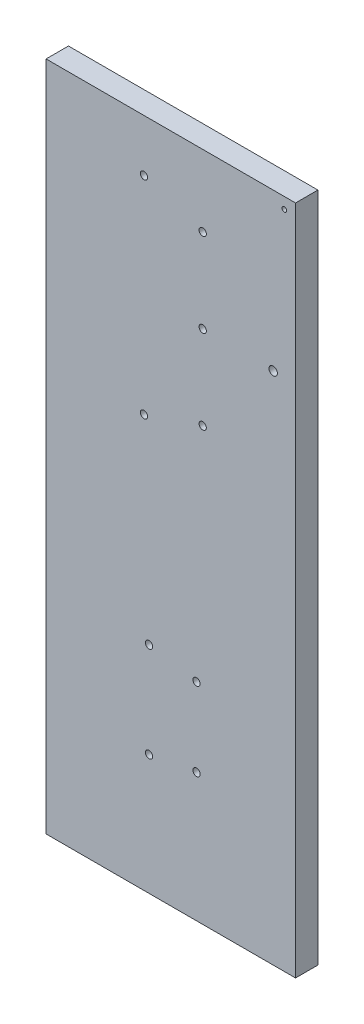
ISO-10303-21;
HEADER;
FILE_DESCRIPTION(('STEP AP214'),'2;1');
FILE_NAME('part.step','',(''),(''),'','','');
FILE_SCHEMA(('AUTOMOTIVE_DESIGN { 1 0 10303 214 1 1 1 1 }'));
ENDSEC;
DATA;
#1=APPLICATION_CONTEXT('core data for automotive mechanical design processes');
#2=APPLICATION_PROTOCOL_DEFINITION('international standard','automotive_design',2000,#1);
#3=PRODUCT_CONTEXT('',#1,'mechanical');
#4=PRODUCT('Part','Part','',(#3));
#5=PRODUCT_RELATED_PRODUCT_CATEGORY('part','',(#4));
#6=PRODUCT_DEFINITION_FORMATION('','',#4);
#7=PRODUCT_DEFINITION_CONTEXT('part definition',#1,'design');
#8=PRODUCT_DEFINITION('design','',#6,#7);
#9=PRODUCT_DEFINITION_SHAPE('','',#8);
#10=(LENGTH_UNIT() NAMED_UNIT(*) SI_UNIT(.MILLI.,.METRE.));
#11=(NAMED_UNIT(*) PLANE_ANGLE_UNIT() SI_UNIT($,.RADIAN.));
#12=(NAMED_UNIT(*) SI_UNIT($,.STERADIAN.) SOLID_ANGLE_UNIT());
#13=UNCERTAINTY_MEASURE_WITH_UNIT(LENGTH_MEASURE(1.E-05),#10,'distance_accuracy_value','');
#14=(GEOMETRIC_REPRESENTATION_CONTEXT(3) GLOBAL_UNCERTAINTY_ASSIGNED_CONTEXT((#13)) GLOBAL_UNIT_ASSIGNED_CONTEXT((#10,
#11,#12)) REPRESENTATION_CONTEXT('',''));
#15=CARTESIAN_POINT('',(0.,0.,0.));
#16=DIRECTION('',(0.,0.,1.));
#17=DIRECTION('',(1.,0.,0.));
#18=AXIS2_PLACEMENT_3D('',#15,#16,#17);
#19=CARTESIAN_POINT('',(0.,0.,20.));
#20=DIRECTION('',(1.,0.,0.));
#21=DIRECTION('',(0.,0.,-1.));
#22=AXIS2_PLACEMENT_3D('',#19,#20,#21);
#23=PLANE('',#22);
#24=DIRECTION('',(0.,-1.,0.));
#25=VECTOR('',#24,1.);
#26=CARTESIAN_POINT('',(0.,0.,0.));
#27=LINE('',#26,#25);
#28=CARTESIAN_POINT('',(0.,600.,0.));
#29=VERTEX_POINT('',#28);
#30=CARTESIAN_POINT('',(0.,0.,0.));
#31=VERTEX_POINT('',#30);
#32=EDGE_CURVE('E216',#29,#31,#27,.T.);
#33=ORIENTED_EDGE('',*,*,#32,.T.);
#34=DIRECTION('',(0.,0.,-1.));
#35=VECTOR('',#34,1.);
#36=CARTESIAN_POINT('',(0.,0.,20.));
#37=LINE('',#36,#35);
#38=CARTESIAN_POINT('',(0.,0.,20.));
#39=VERTEX_POINT('',#38);
#40=EDGE_CURVE('E11',#39,#31,#37,.T.);
#41=ORIENTED_EDGE('',*,*,#40,.F.);
#42=DIRECTION('',(0.,-1.,0.));
#43=VECTOR('',#42,1.);
#44=CARTESIAN_POINT('',(0.,0.,20.));
#45=LINE('',#44,#43);
#46=CARTESIAN_POINT('',(0.,600.,20.));
#47=VERTEX_POINT('',#46);
#48=EDGE_CURVE('E217',#47,#39,#45,.T.);
#49=ORIENTED_EDGE('',*,*,#48,.F.);
#50=DIRECTION('',(0.,0.,-1.));
#51=VECTOR('',#50,1.);
#52=CARTESIAN_POINT('',(0.,600.,20.));
#53=LINE('',#52,#51);
#54=EDGE_CURVE('E223',#47,#29,#53,.T.);
#55=ORIENTED_EDGE('',*,*,#54,.T.);
#56=EDGE_LOOP('',(#33,#41,#49,#55));
#57=FACE_BOUND('',#56,.T.);
#58=ADVANCED_FACE('F36',(#57),#23,.F.);
#59=CARTESIAN_POINT('',(0.,0.,20.));
#60=DIRECTION('',(0.,1.,0.));
#61=DIRECTION('',(0.,0.,1.));
#62=AXIS2_PLACEMENT_3D('',#59,#60,#61);
#63=PLANE('',#62);
#64=DIRECTION('',(1.,0.,0.));
#65=VECTOR('',#64,1.);
#66=CARTESIAN_POINT('',(0.,0.,0.));
#67=LINE('',#66,#65);
#68=CARTESIAN_POINT('',(223.,0.,0.));
#69=VERTEX_POINT('',#68);
#70=EDGE_CURVE('E226',#31,#69,#67,.T.);
#71=ORIENTED_EDGE('',*,*,#70,.T.);
#72=DIRECTION('',(0.,0.,-1.));
#73=VECTOR('',#72,1.);
#74=CARTESIAN_POINT('',(223.,0.,20.));
#75=LINE('',#74,#73);
#76=CARTESIAN_POINT('',(223.,0.,20.));
#77=VERTEX_POINT('',#76);
#78=EDGE_CURVE('E44',#77,#69,#75,.T.);
#79=ORIENTED_EDGE('',*,*,#78,.F.);
#80=DIRECTION('',(1.,0.,0.));
#81=VECTOR('',#80,1.);
#82=CARTESIAN_POINT('',(0.,0.,20.));
#83=LINE('',#82,#81);
#84=EDGE_CURVE('E83',#39,#77,#83,.T.);
#85=ORIENTED_EDGE('',*,*,#84,.F.);
#86=ORIENTED_EDGE('',*,*,#40,.T.);
#87=EDGE_LOOP('',(#71,#79,#85,#86));
#88=FACE_BOUND('',#87,.T.);
#89=ADVANCED_FACE('F250',(#88),#63,.F.);
#90=CARTESIAN_POINT('',(223.,0.,20.));
#91=DIRECTION('',(-1.,0.,0.));
#92=DIRECTION('',(0.,0.,1.));
#93=AXIS2_PLACEMENT_3D('',#90,#91,#92);
#94=PLANE('',#93);
#95=DIRECTION('',(0.,1.,0.));
#96=VECTOR('',#95,1.);
#97=CARTESIAN_POINT('',(223.,0.,0.));
#98=LINE('',#97,#96);
#99=CARTESIAN_POINT('',(223.,600.,0.));
#100=VERTEX_POINT('',#99);
#101=EDGE_CURVE('E70',#69,#100,#98,.T.);
#102=ORIENTED_EDGE('',*,*,#101,.T.);
#103=DIRECTION('',(0.,0.,-1.));
#104=VECTOR('',#103,1.);
#105=CARTESIAN_POINT('',(223.,600.,20.));
#106=LINE('',#105,#104);
#107=CARTESIAN_POINT('',(223.,600.,20.));
#108=VERTEX_POINT('',#107);
#109=EDGE_CURVE('E231',#108,#100,#106,.T.);
#110=ORIENTED_EDGE('',*,*,#109,.F.);
#111=DIRECTION('',(0.,1.,0.));
#112=VECTOR('',#111,1.);
#113=CARTESIAN_POINT('',(223.,0.,20.));
#114=LINE('',#113,#112);
#115=EDGE_CURVE('E220',#77,#108,#114,.T.);
#116=ORIENTED_EDGE('',*,*,#115,.F.);
#117=ORIENTED_EDGE('',*,*,#78,.T.);
#118=EDGE_LOOP('',(#102,#110,#116,#117));
#119=FACE_BOUND('',#118,.T.);
#120=ADVANCED_FACE('F233',(#119),#94,.F.);
#121=CARTESIAN_POINT('',(0.,600.,20.));
#122=DIRECTION('',(0.,-1.,0.));
#123=DIRECTION('',(0.,0.,-1.));
#124=AXIS2_PLACEMENT_3D('',#121,#122,#123);
#125=PLANE('',#124);
#126=DIRECTION('',(-1.,0.,0.));
#127=VECTOR('',#126,1.);
#128=CARTESIAN_POINT('',(0.,600.,0.));
#129=LINE('',#128,#127);
#130=EDGE_CURVE('E76',#100,#29,#129,.T.);
#131=ORIENTED_EDGE('',*,*,#130,.T.);
#132=ORIENTED_EDGE('',*,*,#54,.F.);
#133=DIRECTION('',(-1.,0.,0.));
#134=VECTOR('',#133,1.);
#135=CARTESIAN_POINT('',(0.,600.,20.));
#136=LINE('',#135,#134);
#137=EDGE_CURVE('E52',#108,#47,#136,.T.);
#138=ORIENTED_EDGE('',*,*,#137,.F.);
#139=ORIENTED_EDGE('',*,*,#109,.T.);
#140=EDGE_LOOP('',(#131,#132,#138,#139));
#141=FACE_BOUND('',#140,.T.);
#142=ADVANCED_FACE('F240',(#141),#125,.F.);
#143=CARTESIAN_POINT('',(0.,600.,20.));
#144=DIRECTION('',(0.,0.,-1.));
#145=DIRECTION('',(-1.,0.,0.));
#146=AXIS2_PLACEMENT_3D('',#143,#144,#145);
#147=PLANE('',#146);
#148=CARTESIAN_POINT('',(213.,590.,20.));
#149=DIRECTION('',(0.,0.,1.));
#150=DIRECTION('',(1.,0.,0.));
#151=AXIS2_PLACEMENT_3D('',#148,#149,#150);
#152=CIRCLE('',#151,2.09999999999999);
#153=CARTESIAN_POINT('',(215.1,590.,20.));
#154=VERTEX_POINT('',#153);
#155=EDGE_CURVE('E98',#154,#154,#152,.T.);
#156=ORIENTED_EDGE('',*,*,#155,.F.);
#157=EDGE_LOOP('',(#156));
#158=FACE_BOUND('',#157,.T.);
#159=CARTESIAN_POINT('',(203.,460.,20.));
#160=DIRECTION('',(0.,0.,1.));
#161=DIRECTION('',(1.,0.,0.));
#162=AXIS2_PLACEMENT_3D('',#159,#160,#161);
#163=CIRCLE('',#162,3.75000000000001);
#164=CARTESIAN_POINT('',(206.75,460.,20.));
#165=VERTEX_POINT('',#164);
#166=EDGE_CURVE('E97',#165,#165,#163,.T.);
#167=ORIENTED_EDGE('',*,*,#166,.F.);
#168=EDGE_LOOP('',(#167));
#169=FACE_BOUND('',#168,.T.);
#170=CARTESIAN_POINT('',(87.5,368.5,20.));
#171=DIRECTION('',(0.,0.,-1.));
#172=DIRECTION('',(-1.,0.,0.));
#173=AXIS2_PLACEMENT_3D('',#170,#171,#172);
#174=CIRCLE('',#173,3.24999999999999);
#175=CARTESIAN_POINT('',(84.25,368.5,20.));
#176=VERTEX_POINT('',#175);
#177=EDGE_CURVE('E117',#176,#176,#174,.T.);
#178=ORIENTED_EDGE('',*,*,#177,.T.);
#179=EDGE_LOOP('',(#178));
#180=FACE_BOUND('',#179,.T.);
#181=CARTESIAN_POINT('',(87.5,553.5,20.));
#182=DIRECTION('',(0.,0.,-1.));
#183=DIRECTION('',(-1.,0.,0.));
#184=AXIS2_PLACEMENT_3D('',#181,#182,#183);
#185=CIRCLE('',#184,3.24999999999999);
#186=CARTESIAN_POINT('',(84.25,553.5,20.));
#187=VERTEX_POINT('',#186);
#188=EDGE_CURVE('E129',#187,#187,#185,.T.);
#189=ORIENTED_EDGE('',*,*,#188,.T.);
#190=EDGE_LOOP('',(#189));
#191=FACE_BOUND('',#190,.T.);
#192=CARTESIAN_POINT('',(140.,386.,20.));
#193=DIRECTION('',(0.,0.,-1.));
#194=DIRECTION('',(-1.,0.,0.));
#195=AXIS2_PLACEMENT_3D('',#192,#193,#194);
#196=CIRCLE('',#195,3.25);
#197=CARTESIAN_POINT('',(136.75,386.,20.));
#198=VERTEX_POINT('',#197);
#199=EDGE_CURVE('E141',#198,#198,#196,.T.);
#200=ORIENTED_EDGE('',*,*,#199,.T.);
#201=EDGE_LOOP('',(#200));
#202=FACE_BOUND('',#201,.T.);
#203=CARTESIAN_POINT('',(140.,461.,20.));
#204=DIRECTION('',(0.,0.,-1.));
#205=DIRECTION('',(-1.,0.,0.));
#206=AXIS2_PLACEMENT_3D('',#203,#204,#205);
#207=CIRCLE('',#206,3.25);
#208=CARTESIAN_POINT('',(136.75,461.,20.));
#209=VERTEX_POINT('',#208);
#210=EDGE_CURVE('E153',#209,#209,#207,.T.);
#211=ORIENTED_EDGE('',*,*,#210,.T.);
#212=EDGE_LOOP('',(#211));
#213=FACE_BOUND('',#212,.T.);
#214=CARTESIAN_POINT('',(140.,536.,20.));
#215=DIRECTION('',(0.,0.,-1.));
#216=DIRECTION('',(-1.,0.,0.));
#217=AXIS2_PLACEMENT_3D('',#214,#215,#216);
#218=CIRCLE('',#217,3.25);
#219=CARTESIAN_POINT('',(136.75,536.,20.));
#220=VERTEX_POINT('',#219);
#221=EDGE_CURVE('E165',#220,#220,#218,.T.);
#222=ORIENTED_EDGE('',*,*,#221,.T.);
#223=EDGE_LOOP('',(#222));
#224=FACE_BOUND('',#223,.T.);
#225=CARTESIAN_POINT('',(134.5,115.,20.));
#226=DIRECTION('',(0.,0.,-1.));
#227=DIRECTION('',(-1.,0.,0.));
#228=AXIS2_PLACEMENT_3D('',#225,#226,#227);
#229=CIRCLE('',#228,3.25);
#230=CARTESIAN_POINT('',(131.25,115.,20.));
#231=VERTEX_POINT('',#230);
#232=EDGE_CURVE('E177',#231,#231,#229,.T.);
#233=ORIENTED_EDGE('',*,*,#232,.T.);
#234=EDGE_LOOP('',(#233));
#235=FACE_BOUND('',#234,.T.);
#236=CARTESIAN_POINT('',(134.5,185.,20.));
#237=DIRECTION('',(0.,0.,-1.));
#238=DIRECTION('',(-1.,0.,0.));
#239=AXIS2_PLACEMENT_3D('',#236,#237,#238);
#240=CIRCLE('',#239,3.25);
#241=CARTESIAN_POINT('',(131.25,185.,20.));
#242=VERTEX_POINT('',#241);
#243=EDGE_CURVE('E189',#242,#242,#240,.T.);
#244=ORIENTED_EDGE('',*,*,#243,.T.);
#245=EDGE_LOOP('',(#244));
#246=FACE_BOUND('',#245,.T.);
#247=CARTESIAN_POINT('',(92.,107.5,20.));
#248=DIRECTION('',(0.,0.,-1.));
#249=DIRECTION('',(-1.,0.,0.));
#250=AXIS2_PLACEMENT_3D('',#247,#248,#249);
#251=CIRCLE('',#250,3.24999999999999);
#252=CARTESIAN_POINT('',(88.75,107.5,20.));
#253=VERTEX_POINT('',#252);
#254=EDGE_CURVE('E201',#253,#253,#251,.T.);
#255=ORIENTED_EDGE('',*,*,#254,.T.);
#256=EDGE_LOOP('',(#255));
#257=FACE_BOUND('',#256,.T.);
#258=CARTESIAN_POINT('',(92.,192.5,20.));
#259=DIRECTION('',(0.,0.,-1.));
#260=DIRECTION('',(-1.,0.,0.));
#261=AXIS2_PLACEMENT_3D('',#258,#259,#260);
#262=CIRCLE('',#261,3.24999999999999);
#263=CARTESIAN_POINT('',(88.75,192.5,20.));
#264=VERTEX_POINT('',#263);
#265=EDGE_CURVE('E213',#264,#264,#262,.T.);
#266=ORIENTED_EDGE('',*,*,#265,.T.);
#267=EDGE_LOOP('',(#266));
#268=FACE_BOUND('',#267,.T.);
#269=ORIENTED_EDGE('',*,*,#48,.T.);
#270=ORIENTED_EDGE('',*,*,#84,.T.);
#271=ORIENTED_EDGE('',*,*,#115,.T.);
#272=ORIENTED_EDGE('',*,*,#137,.T.);
#273=EDGE_LOOP('',(#269,#270,#271,#272));
#274=FACE_BOUND('',#273,.T.);
#275=ADVANCED_FACE('F242',(#158,#169,#180,#191,#202,#213,#224,#235,#246,#257,#268,#274),#147,.F.);
#276=CARTESIAN_POINT('',(0.,600.,0.));
#277=DIRECTION('',(0.,0.,-1.));
#278=DIRECTION('',(-1.,0.,0.));
#279=AXIS2_PLACEMENT_3D('',#276,#277,#278);
#280=PLANE('',#279);
#281=CARTESIAN_POINT('',(203.,460.,0.));
#282=DIRECTION('',(0.,0.,1.));
#283=DIRECTION('',(1.,0.,0.));
#284=AXIS2_PLACEMENT_3D('',#281,#282,#283);
#285=CIRCLE('',#284,3.75000000000001);
#286=CARTESIAN_POINT('',(206.75,460.,0.));
#287=VERTEX_POINT('',#286);
#288=EDGE_CURVE('E101',#287,#287,#285,.T.);
#289=ORIENTED_EDGE('',*,*,#288,.T.);
#290=EDGE_LOOP('',(#289));
#291=FACE_BOUND('',#290,.T.);
#292=CARTESIAN_POINT('',(87.5,368.5,0.));
#293=DIRECTION('',(0.,0.,-1.));
#294=DIRECTION('',(-1.,0.,0.));
#295=AXIS2_PLACEMENT_3D('',#292,#293,#294);
#296=CIRCLE('',#295,7.49999999999999);
#297=CARTESIAN_POINT('',(80.,368.5,0.));
#298=VERTEX_POINT('',#297);
#299=EDGE_CURVE('E107',#298,#298,#296,.T.);
#300=ORIENTED_EDGE('',*,*,#299,.F.);
#301=EDGE_LOOP('',(#300));
#302=FACE_BOUND('',#301,.T.);
#303=CARTESIAN_POINT('',(87.5,553.5,0.));
#304=DIRECTION('',(0.,0.,-1.));
#305=DIRECTION('',(-1.,0.,0.));
#306=AXIS2_PLACEMENT_3D('',#303,#304,#305);
#307=CIRCLE('',#306,7.49999999999999);
#308=CARTESIAN_POINT('',(80.,553.5,0.));
#309=VERTEX_POINT('',#308);
#310=EDGE_CURVE('E120',#309,#309,#307,.T.);
#311=ORIENTED_EDGE('',*,*,#310,.F.);
#312=EDGE_LOOP('',(#311));
#313=FACE_BOUND('',#312,.T.);
#314=CARTESIAN_POINT('',(140.,386.,0.));
#315=DIRECTION('',(0.,0.,-1.));
#316=DIRECTION('',(-1.,0.,0.));
#317=AXIS2_PLACEMENT_3D('',#314,#315,#316);
#318=CIRCLE('',#317,7.50000000000001);
#319=CARTESIAN_POINT('',(132.5,386.,0.));
#320=VERTEX_POINT('',#319);
#321=EDGE_CURVE('E132',#320,#320,#318,.T.);
#322=ORIENTED_EDGE('',*,*,#321,.F.);
#323=EDGE_LOOP('',(#322));
#324=FACE_BOUND('',#323,.T.);
#325=CARTESIAN_POINT('',(140.,461.,0.));
#326=DIRECTION('',(0.,0.,-1.));
#327=DIRECTION('',(-1.,0.,0.));
#328=AXIS2_PLACEMENT_3D('',#325,#326,#327);
#329=CIRCLE('',#328,7.50000000000001);
#330=CARTESIAN_POINT('',(132.5,461.,0.));
#331=VERTEX_POINT('',#330);
#332=EDGE_CURVE('E144',#331,#331,#329,.T.);
#333=ORIENTED_EDGE('',*,*,#332,.F.);
#334=EDGE_LOOP('',(#333));
#335=FACE_BOUND('',#334,.T.);
#336=CARTESIAN_POINT('',(140.,536.,0.));
#337=DIRECTION('',(0.,0.,-1.));
#338=DIRECTION('',(-1.,0.,0.));
#339=AXIS2_PLACEMENT_3D('',#336,#337,#338);
#340=CIRCLE('',#339,7.50000000000001);
#341=CARTESIAN_POINT('',(132.5,536.,0.));
#342=VERTEX_POINT('',#341);
#343=EDGE_CURVE('E156',#342,#342,#340,.T.);
#344=ORIENTED_EDGE('',*,*,#343,.F.);
#345=EDGE_LOOP('',(#344));
#346=FACE_BOUND('',#345,.T.);
#347=CARTESIAN_POINT('',(134.5,115.,0.));
#348=DIRECTION('',(0.,0.,-1.));
#349=DIRECTION('',(-1.,0.,0.));
#350=AXIS2_PLACEMENT_3D('',#347,#348,#349);
#351=CIRCLE('',#350,7.50000000000001);
#352=CARTESIAN_POINT('',(127.,115.,0.));
#353=VERTEX_POINT('',#352);
#354=EDGE_CURVE('E168',#353,#353,#351,.T.);
#355=ORIENTED_EDGE('',*,*,#354,.F.);
#356=EDGE_LOOP('',(#355));
#357=FACE_BOUND('',#356,.T.);
#358=CARTESIAN_POINT('',(134.5,185.,0.));
#359=DIRECTION('',(0.,0.,-1.));
#360=DIRECTION('',(-1.,0.,0.));
#361=AXIS2_PLACEMENT_3D('',#358,#359,#360);
#362=CIRCLE('',#361,7.50000000000001);
#363=CARTESIAN_POINT('',(127.,185.,0.));
#364=VERTEX_POINT('',#363);
#365=EDGE_CURVE('E180',#364,#364,#362,.T.);
#366=ORIENTED_EDGE('',*,*,#365,.F.);
#367=EDGE_LOOP('',(#366));
#368=FACE_BOUND('',#367,.T.);
#369=CARTESIAN_POINT('',(92.,107.5,0.));
#370=DIRECTION('',(0.,0.,-1.));
#371=DIRECTION('',(-1.,0.,0.));
#372=AXIS2_PLACEMENT_3D('',#369,#370,#371);
#373=CIRCLE('',#372,7.50000000000001);
#374=CARTESIAN_POINT('',(84.5,107.5,0.));
#375=VERTEX_POINT('',#374);
#376=EDGE_CURVE('E192',#375,#375,#373,.T.);
#377=ORIENTED_EDGE('',*,*,#376,.F.);
#378=EDGE_LOOP('',(#377));
#379=FACE_BOUND('',#378,.T.);
#380=CARTESIAN_POINT('',(92.,192.5,0.));
#381=DIRECTION('',(0.,0.,-1.));
#382=DIRECTION('',(-1.,0.,0.));
#383=AXIS2_PLACEMENT_3D('',#380,#381,#382);
#384=CIRCLE('',#383,7.50000000000001);
#385=CARTESIAN_POINT('',(84.5,192.5,0.));
#386=VERTEX_POINT('',#385);
#387=EDGE_CURVE('E204',#386,#386,#384,.T.);
#388=ORIENTED_EDGE('',*,*,#387,.F.);
#389=EDGE_LOOP('',(#388));
#390=FACE_BOUND('',#389,.T.);
#391=ORIENTED_EDGE('',*,*,#32,.F.);
#392=ORIENTED_EDGE('',*,*,#130,.F.);
#393=ORIENTED_EDGE('',*,*,#101,.F.);
#394=ORIENTED_EDGE('',*,*,#70,.F.);
#395=EDGE_LOOP('',(#391,#392,#393,#394));
#396=FACE_BOUND('',#395,.T.);
#397=ADVANCED_FACE('F236',(#291,#302,#313,#324,#335,#346,#357,#368,#379,#390,#396),#280,.T.);
#398=CARTESIAN_POINT('',(92.,192.5,0.));
#399=DIRECTION('',(0.,0.,-1.));
#400=DIRECTION('',(-1.,0.,0.));
#401=AXIS2_PLACEMENT_3D('',#398,#399,#400);
#402=CYLINDRICAL_SURFACE('',#401,3.25);
#403=ORIENTED_EDGE('',*,*,#265,.F.);
#404=EDGE_LOOP('',(#403));
#405=FACE_BOUND('',#404,.T.);
#406=CARTESIAN_POINT('',(92.,192.5,10.));
#407=DIRECTION('',(0.,0.,-1.));
#408=DIRECTION('',(-1.,0.,0.));
#409=AXIS2_PLACEMENT_3D('',#406,#407,#408);
#410=CIRCLE('',#409,3.25);
#411=CARTESIAN_POINT('',(88.75,192.5,10.));
#412=VERTEX_POINT('',#411);
#413=EDGE_CURVE('E210',#412,#412,#410,.T.);
#414=ORIENTED_EDGE('',*,*,#413,.T.);
#415=EDGE_LOOP('',(#414));
#416=FACE_BOUND('',#415,.T.);
#417=ADVANCED_FACE('F273',(#405,#416),#402,.F.);
#418=CARTESIAN_POINT('',(95.25,192.5,10.));
#419=DIRECTION('',(0.,0.,1.));
#420=DIRECTION('',(1.,0.,0.));
#421=AXIS2_PLACEMENT_3D('',#418,#419,#420);
#422=PLANE('',#421);
#423=ORIENTED_EDGE('',*,*,#413,.F.);
#424=EDGE_LOOP('',(#423));
#425=FACE_BOUND('',#424,.T.);
#426=CARTESIAN_POINT('',(92.,192.5,10.));
#427=DIRECTION('',(0.,0.,-1.));
#428=DIRECTION('',(-1.,0.,0.));
#429=AXIS2_PLACEMENT_3D('',#426,#427,#428);
#430=CIRCLE('',#429,7.49999999999999);
#431=CARTESIAN_POINT('',(84.5,192.5,10.));
#432=VERTEX_POINT('',#431);
#433=EDGE_CURVE('E207',#432,#432,#430,.T.);
#434=ORIENTED_EDGE('',*,*,#433,.T.);
#435=EDGE_LOOP('',(#434));
#436=FACE_BOUND('',#435,.T.);
#437=ADVANCED_FACE('F278',(#425,#436),#422,.F.);
#438=CARTESIAN_POINT('',(92.,192.5,0.));
#439=DIRECTION('',(0.,0.,-1.));
#440=DIRECTION('',(-1.,0.,0.));
#441=AXIS2_PLACEMENT_3D('',#438,#439,#440);
#442=CYLINDRICAL_SURFACE('',#441,7.5);
#443=ORIENTED_EDGE('',*,*,#433,.F.);
#444=EDGE_LOOP('',(#443));
#445=FACE_BOUND('',#444,.T.);
#446=ORIENTED_EDGE('',*,*,#387,.T.);
#447=EDGE_LOOP('',(#446));
#448=FACE_BOUND('',#447,.T.);
#449=ADVANCED_FACE('F290',(#445,#448),#442,.F.);
#450=CARTESIAN_POINT('',(92.,107.5,0.));
#451=DIRECTION('',(0.,0.,-1.));
#452=DIRECTION('',(-1.,0.,0.));
#453=AXIS2_PLACEMENT_3D('',#450,#451,#452);
#454=CYLINDRICAL_SURFACE('',#453,3.25);
#455=ORIENTED_EDGE('',*,*,#254,.F.);
#456=EDGE_LOOP('',(#455));
#457=FACE_BOUND('',#456,.T.);
#458=CARTESIAN_POINT('',(92.,107.5,10.));
#459=DIRECTION('',(0.,0.,-1.));
#460=DIRECTION('',(-1.,0.,0.));
#461=AXIS2_PLACEMENT_3D('',#458,#459,#460);
#462=CIRCLE('',#461,3.25);
#463=CARTESIAN_POINT('',(88.75,107.5,10.));
#464=VERTEX_POINT('',#463);
#465=EDGE_CURVE('E198',#464,#464,#462,.T.);
#466=ORIENTED_EDGE('',*,*,#465,.T.);
#467=EDGE_LOOP('',(#466));
#468=FACE_BOUND('',#467,.T.);
#469=ADVANCED_FACE('F300',(#457,#468),#454,.F.);
#470=CARTESIAN_POINT('',(95.25,107.5,10.));
#471=DIRECTION('',(0.,0.,1.));
#472=DIRECTION('',(1.,0.,0.));
#473=AXIS2_PLACEMENT_3D('',#470,#471,#472);
#474=PLANE('',#473);
#475=ORIENTED_EDGE('',*,*,#465,.F.);
#476=EDGE_LOOP('',(#475));
#477=FACE_BOUND('',#476,.T.);
#478=CARTESIAN_POINT('',(92.,107.5,10.));
#479=DIRECTION('',(0.,0.,-1.));
#480=DIRECTION('',(-1.,0.,0.));
#481=AXIS2_PLACEMENT_3D('',#478,#479,#480);
#482=CIRCLE('',#481,7.49999999999999);
#483=CARTESIAN_POINT('',(84.5,107.5,10.));
#484=VERTEX_POINT('',#483);
#485=EDGE_CURVE('E195',#484,#484,#482,.T.);
#486=ORIENTED_EDGE('',*,*,#485,.T.);
#487=EDGE_LOOP('',(#486));
#488=FACE_BOUND('',#487,.T.);
#489=ADVANCED_FACE('F310',(#477,#488),#474,.F.);
#490=CARTESIAN_POINT('',(92.,107.5,0.));
#491=DIRECTION('',(0.,0.,-1.));
#492=DIRECTION('',(-1.,0.,0.));
#493=AXIS2_PLACEMENT_3D('',#490,#491,#492);
#494=CYLINDRICAL_SURFACE('',#493,7.5);
#495=ORIENTED_EDGE('',*,*,#485,.F.);
#496=EDGE_LOOP('',(#495));
#497=FACE_BOUND('',#496,.T.);
#498=ORIENTED_EDGE('',*,*,#376,.T.);
#499=EDGE_LOOP('',(#498));
#500=FACE_BOUND('',#499,.T.);
#501=ADVANCED_FACE('F320',(#497,#500),#494,.F.);
#502=CARTESIAN_POINT('',(134.5,185.,0.));
#503=DIRECTION('',(0.,0.,-1.));
#504=DIRECTION('',(-1.,0.,0.));
#505=AXIS2_PLACEMENT_3D('',#502,#503,#504);
#506=CYLINDRICAL_SURFACE('',#505,3.25);
#507=ORIENTED_EDGE('',*,*,#243,.F.);
#508=EDGE_LOOP('',(#507));
#509=FACE_BOUND('',#508,.T.);
#510=CARTESIAN_POINT('',(134.5,185.,10.));
#511=DIRECTION('',(0.,0.,-1.));
#512=DIRECTION('',(-1.,0.,0.));
#513=AXIS2_PLACEMENT_3D('',#510,#511,#512);
#514=CIRCLE('',#513,3.25);
#515=CARTESIAN_POINT('',(131.25,185.,10.));
#516=VERTEX_POINT('',#515);
#517=EDGE_CURVE('E186',#516,#516,#514,.T.);
#518=ORIENTED_EDGE('',*,*,#517,.T.);
#519=EDGE_LOOP('',(#518));
#520=FACE_BOUND('',#519,.T.);
#521=ADVANCED_FACE('F330',(#509,#520),#506,.F.);
#522=CARTESIAN_POINT('',(137.75,185.,10.));
#523=DIRECTION('',(0.,0.,1.));
#524=DIRECTION('',(1.,0.,0.));
#525=AXIS2_PLACEMENT_3D('',#522,#523,#524);
#526=PLANE('',#525);
#527=ORIENTED_EDGE('',*,*,#517,.F.);
#528=EDGE_LOOP('',(#527));
#529=FACE_BOUND('',#528,.T.);
#530=CARTESIAN_POINT('',(134.5,185.,10.));
#531=DIRECTION('',(0.,0.,-1.));
#532=DIRECTION('',(-1.,0.,0.));
#533=AXIS2_PLACEMENT_3D('',#530,#531,#532);
#534=CIRCLE('',#533,7.50000000000001);
#535=CARTESIAN_POINT('',(127.,185.,10.));
#536=VERTEX_POINT('',#535);
#537=EDGE_CURVE('E183',#536,#536,#534,.T.);
#538=ORIENTED_EDGE('',*,*,#537,.T.);
#539=EDGE_LOOP('',(#538));
#540=FACE_BOUND('',#539,.T.);
#541=ADVANCED_FACE('F340',(#529,#540),#526,.F.);
#542=CARTESIAN_POINT('',(134.5,185.,0.));
#543=DIRECTION('',(0.,0.,-1.));
#544=DIRECTION('',(-1.,0.,0.));
#545=AXIS2_PLACEMENT_3D('',#542,#543,#544);
#546=CYLINDRICAL_SURFACE('',#545,7.50000000000001);
#547=ORIENTED_EDGE('',*,*,#537,.F.);
#548=EDGE_LOOP('',(#547));
#549=FACE_BOUND('',#548,.T.);
#550=ORIENTED_EDGE('',*,*,#365,.T.);
#551=EDGE_LOOP('',(#550));
#552=FACE_BOUND('',#551,.T.);
#553=ADVANCED_FACE('F350',(#549,#552),#546,.F.);
#554=CARTESIAN_POINT('',(134.5,115.,0.));
#555=DIRECTION('',(0.,0.,-1.));
#556=DIRECTION('',(-1.,0.,0.));
#557=AXIS2_PLACEMENT_3D('',#554,#555,#556);
#558=CYLINDRICAL_SURFACE('',#557,3.25);
#559=ORIENTED_EDGE('',*,*,#232,.F.);
#560=EDGE_LOOP('',(#559));
#561=FACE_BOUND('',#560,.T.);
#562=CARTESIAN_POINT('',(134.5,115.,10.));
#563=DIRECTION('',(0.,0.,-1.));
#564=DIRECTION('',(-1.,0.,0.));
#565=AXIS2_PLACEMENT_3D('',#562,#563,#564);
#566=CIRCLE('',#565,3.25);
#567=CARTESIAN_POINT('',(131.25,115.,10.));
#568=VERTEX_POINT('',#567);
#569=EDGE_CURVE('E174',#568,#568,#566,.T.);
#570=ORIENTED_EDGE('',*,*,#569,.T.);
#571=EDGE_LOOP('',(#570));
#572=FACE_BOUND('',#571,.T.);
#573=ADVANCED_FACE('F360',(#561,#572),#558,.F.);
#574=CARTESIAN_POINT('',(137.75,115.,10.));
#575=DIRECTION('',(0.,0.,1.));
#576=DIRECTION('',(1.,0.,0.));
#577=AXIS2_PLACEMENT_3D('',#574,#575,#576);
#578=PLANE('',#577);
#579=ORIENTED_EDGE('',*,*,#569,.F.);
#580=EDGE_LOOP('',(#579));
#581=FACE_BOUND('',#580,.T.);
#582=CARTESIAN_POINT('',(134.5,115.,10.));
#583=DIRECTION('',(0.,0.,-1.));
#584=DIRECTION('',(-1.,0.,0.));
#585=AXIS2_PLACEMENT_3D('',#582,#583,#584);
#586=CIRCLE('',#585,7.50000000000001);
#587=CARTESIAN_POINT('',(127.,115.,10.));
#588=VERTEX_POINT('',#587);
#589=EDGE_CURVE('E171',#588,#588,#586,.T.);
#590=ORIENTED_EDGE('',*,*,#589,.T.);
#591=EDGE_LOOP('',(#590));
#592=FACE_BOUND('',#591,.T.);
#593=ADVANCED_FACE('F370',(#581,#592),#578,.F.);
#594=CARTESIAN_POINT('',(134.5,115.,0.));
#595=DIRECTION('',(0.,0.,-1.));
#596=DIRECTION('',(-1.,0.,0.));
#597=AXIS2_PLACEMENT_3D('',#594,#595,#596);
#598=CYLINDRICAL_SURFACE('',#597,7.50000000000001);
#599=ORIENTED_EDGE('',*,*,#589,.F.);
#600=EDGE_LOOP('',(#599));
#601=FACE_BOUND('',#600,.T.);
#602=ORIENTED_EDGE('',*,*,#354,.T.);
#603=EDGE_LOOP('',(#602));
#604=FACE_BOUND('',#603,.T.);
#605=ADVANCED_FACE('F380',(#601,#604),#598,.F.);
#606=CARTESIAN_POINT('',(140.,536.,0.));
#607=DIRECTION('',(0.,0.,-1.));
#608=DIRECTION('',(-1.,0.,0.));
#609=AXIS2_PLACEMENT_3D('',#606,#607,#608);
#610=CYLINDRICAL_SURFACE('',#609,3.25);
#611=ORIENTED_EDGE('',*,*,#221,.F.);
#612=EDGE_LOOP('',(#611));
#613=FACE_BOUND('',#612,.T.);
#614=CARTESIAN_POINT('',(140.,536.,10.));
#615=DIRECTION('',(0.,0.,-1.));
#616=DIRECTION('',(-1.,0.,0.));
#617=AXIS2_PLACEMENT_3D('',#614,#615,#616);
#618=CIRCLE('',#617,3.25);
#619=CARTESIAN_POINT('',(136.75,536.,10.));
#620=VERTEX_POINT('',#619);
#621=EDGE_CURVE('E162',#620,#620,#618,.T.);
#622=ORIENTED_EDGE('',*,*,#621,.T.);
#623=EDGE_LOOP('',(#622));
#624=FACE_BOUND('',#623,.T.);
#625=ADVANCED_FACE('F390',(#613,#624),#610,.F.);
#626=CARTESIAN_POINT('',(143.25,536.,10.));
#627=DIRECTION('',(0.,0.,1.));
#628=DIRECTION('',(1.,0.,0.));
#629=AXIS2_PLACEMENT_3D('',#626,#627,#628);
#630=PLANE('',#629);
#631=ORIENTED_EDGE('',*,*,#621,.F.);
#632=EDGE_LOOP('',(#631));
#633=FACE_BOUND('',#632,.T.);
#634=CARTESIAN_POINT('',(140.,536.,10.));
#635=DIRECTION('',(0.,0.,-1.));
#636=DIRECTION('',(-1.,0.,0.));
#637=AXIS2_PLACEMENT_3D('',#634,#635,#636);
#638=CIRCLE('',#637,7.50000000000001);
#639=CARTESIAN_POINT('',(132.5,536.,10.));
#640=VERTEX_POINT('',#639);
#641=EDGE_CURVE('E159',#640,#640,#638,.T.);
#642=ORIENTED_EDGE('',*,*,#641,.T.);
#643=EDGE_LOOP('',(#642));
#644=FACE_BOUND('',#643,.T.);
#645=ADVANCED_FACE('F400',(#633,#644),#630,.F.);
#646=CARTESIAN_POINT('',(140.,536.,0.));
#647=DIRECTION('',(0.,0.,-1.));
#648=DIRECTION('',(-1.,0.,0.));
#649=AXIS2_PLACEMENT_3D('',#646,#647,#648);
#650=CYLINDRICAL_SURFACE('',#649,7.50000000000001);
#651=ORIENTED_EDGE('',*,*,#641,.F.);
#652=EDGE_LOOP('',(#651));
#653=FACE_BOUND('',#652,.T.);
#654=ORIENTED_EDGE('',*,*,#343,.T.);
#655=EDGE_LOOP('',(#654));
#656=FACE_BOUND('',#655,.T.);
#657=ADVANCED_FACE('F410',(#653,#656),#650,.F.);
#658=CARTESIAN_POINT('',(140.,461.,0.));
#659=DIRECTION('',(0.,0.,-1.));
#660=DIRECTION('',(-1.,0.,0.));
#661=AXIS2_PLACEMENT_3D('',#658,#659,#660);
#662=CYLINDRICAL_SURFACE('',#661,3.25);
#663=ORIENTED_EDGE('',*,*,#210,.F.);
#664=EDGE_LOOP('',(#663));
#665=FACE_BOUND('',#664,.T.);
#666=CARTESIAN_POINT('',(140.,461.,10.));
#667=DIRECTION('',(0.,0.,-1.));
#668=DIRECTION('',(-1.,0.,0.));
#669=AXIS2_PLACEMENT_3D('',#666,#667,#668);
#670=CIRCLE('',#669,3.25);
#671=CARTESIAN_POINT('',(136.75,461.,10.));
#672=VERTEX_POINT('',#671);
#673=EDGE_CURVE('E150',#672,#672,#670,.T.);
#674=ORIENTED_EDGE('',*,*,#673,.T.);
#675=EDGE_LOOP('',(#674));
#676=FACE_BOUND('',#675,.T.);
#677=ADVANCED_FACE('F420',(#665,#676),#662,.F.);
#678=CARTESIAN_POINT('',(143.25,461.,10.));
#679=DIRECTION('',(0.,0.,1.));
#680=DIRECTION('',(1.,0.,0.));
#681=AXIS2_PLACEMENT_3D('',#678,#679,#680);
#682=PLANE('',#681);
#683=ORIENTED_EDGE('',*,*,#673,.F.);
#684=EDGE_LOOP('',(#683));
#685=FACE_BOUND('',#684,.T.);
#686=CARTESIAN_POINT('',(140.,461.,10.));
#687=DIRECTION('',(0.,0.,-1.));
#688=DIRECTION('',(-1.,0.,0.));
#689=AXIS2_PLACEMENT_3D('',#686,#687,#688);
#690=CIRCLE('',#689,7.50000000000001);
#691=CARTESIAN_POINT('',(132.5,461.,10.));
#692=VERTEX_POINT('',#691);
#693=EDGE_CURVE('E147',#692,#692,#690,.T.);
#694=ORIENTED_EDGE('',*,*,#693,.T.);
#695=EDGE_LOOP('',(#694));
#696=FACE_BOUND('',#695,.T.);
#697=ADVANCED_FACE('F430',(#685,#696),#682,.F.);
#698=CARTESIAN_POINT('',(140.,461.,0.));
#699=DIRECTION('',(0.,0.,-1.));
#700=DIRECTION('',(-1.,0.,0.));
#701=AXIS2_PLACEMENT_3D('',#698,#699,#700);
#702=CYLINDRICAL_SURFACE('',#701,7.50000000000001);
#703=ORIENTED_EDGE('',*,*,#693,.F.);
#704=EDGE_LOOP('',(#703));
#705=FACE_BOUND('',#704,.T.);
#706=ORIENTED_EDGE('',*,*,#332,.T.);
#707=EDGE_LOOP('',(#706));
#708=FACE_BOUND('',#707,.T.);
#709=ADVANCED_FACE('F440',(#705,#708),#702,.F.);
#710=CARTESIAN_POINT('',(140.,386.,0.));
#711=DIRECTION('',(0.,0.,-1.));
#712=DIRECTION('',(-1.,0.,0.));
#713=AXIS2_PLACEMENT_3D('',#710,#711,#712);
#714=CYLINDRICAL_SURFACE('',#713,3.25);
#715=ORIENTED_EDGE('',*,*,#199,.F.);
#716=EDGE_LOOP('',(#715));
#717=FACE_BOUND('',#716,.T.);
#718=CARTESIAN_POINT('',(140.,386.,10.));
#719=DIRECTION('',(0.,0.,-1.));
#720=DIRECTION('',(-1.,0.,0.));
#721=AXIS2_PLACEMENT_3D('',#718,#719,#720);
#722=CIRCLE('',#721,3.25);
#723=CARTESIAN_POINT('',(136.75,386.,10.));
#724=VERTEX_POINT('',#723);
#725=EDGE_CURVE('E138',#724,#724,#722,.T.);
#726=ORIENTED_EDGE('',*,*,#725,.T.);
#727=EDGE_LOOP('',(#726));
#728=FACE_BOUND('',#727,.T.);
#729=ADVANCED_FACE('F450',(#717,#728),#714,.F.);
#730=CARTESIAN_POINT('',(143.25,386.,10.));
#731=DIRECTION('',(0.,0.,1.));
#732=DIRECTION('',(1.,0.,0.));
#733=AXIS2_PLACEMENT_3D('',#730,#731,#732);
#734=PLANE('',#733);
#735=ORIENTED_EDGE('',*,*,#725,.F.);
#736=EDGE_LOOP('',(#735));
#737=FACE_BOUND('',#736,.T.);
#738=CARTESIAN_POINT('',(140.,386.,10.));
#739=DIRECTION('',(0.,0.,-1.));
#740=DIRECTION('',(-1.,0.,0.));
#741=AXIS2_PLACEMENT_3D('',#738,#739,#740);
#742=CIRCLE('',#741,7.50000000000001);
#743=CARTESIAN_POINT('',(132.5,386.,10.));
#744=VERTEX_POINT('',#743);
#745=EDGE_CURVE('E135',#744,#744,#742,.T.);
#746=ORIENTED_EDGE('',*,*,#745,.T.);
#747=EDGE_LOOP('',(#746));
#748=FACE_BOUND('',#747,.T.);
#749=ADVANCED_FACE('F460',(#737,#748),#734,.F.);
#750=CARTESIAN_POINT('',(140.,386.,0.));
#751=DIRECTION('',(0.,0.,-1.));
#752=DIRECTION('',(-1.,0.,0.));
#753=AXIS2_PLACEMENT_3D('',#750,#751,#752);
#754=CYLINDRICAL_SURFACE('',#753,7.50000000000001);
#755=ORIENTED_EDGE('',*,*,#745,.F.);
#756=EDGE_LOOP('',(#755));
#757=FACE_BOUND('',#756,.T.);
#758=ORIENTED_EDGE('',*,*,#321,.T.);
#759=EDGE_LOOP('',(#758));
#760=FACE_BOUND('',#759,.T.);
#761=ADVANCED_FACE('F470',(#757,#760),#754,.F.);
#762=CARTESIAN_POINT('',(87.5,553.5,0.));
#763=DIRECTION('',(0.,0.,-1.));
#764=DIRECTION('',(-1.,0.,0.));
#765=AXIS2_PLACEMENT_3D('',#762,#763,#764);
#766=CYLINDRICAL_SURFACE('',#765,3.25);
#767=ORIENTED_EDGE('',*,*,#188,.F.);
#768=EDGE_LOOP('',(#767));
#769=FACE_BOUND('',#768,.T.);
#770=CARTESIAN_POINT('',(87.5,553.5,10.));
#771=DIRECTION('',(0.,0.,-1.));
#772=DIRECTION('',(-1.,0.,0.));
#773=AXIS2_PLACEMENT_3D('',#770,#771,#772);
#774=CIRCLE('',#773,3.25);
#775=CARTESIAN_POINT('',(84.25,553.5,10.));
#776=VERTEX_POINT('',#775);
#777=EDGE_CURVE('E126',#776,#776,#774,.T.);
#778=ORIENTED_EDGE('',*,*,#777,.T.);
#779=EDGE_LOOP('',(#778));
#780=FACE_BOUND('',#779,.T.);
#781=ADVANCED_FACE('F480',(#769,#780),#766,.F.);
#782=CARTESIAN_POINT('',(90.75,553.5,10.));
#783=DIRECTION('',(0.,0.,1.));
#784=DIRECTION('',(1.,0.,0.));
#785=AXIS2_PLACEMENT_3D('',#782,#783,#784);
#786=PLANE('',#785);
#787=ORIENTED_EDGE('',*,*,#777,.F.);
#788=EDGE_LOOP('',(#787));
#789=FACE_BOUND('',#788,.T.);
#790=CARTESIAN_POINT('',(87.5,553.5,10.));
#791=DIRECTION('',(0.,0.,-1.));
#792=DIRECTION('',(-1.,0.,0.));
#793=AXIS2_PLACEMENT_3D('',#790,#791,#792);
#794=CIRCLE('',#793,7.50000000000001);
#795=CARTESIAN_POINT('',(80.,553.5,10.));
#796=VERTEX_POINT('',#795);
#797=EDGE_CURVE('E123',#796,#796,#794,.T.);
#798=ORIENTED_EDGE('',*,*,#797,.T.);
#799=EDGE_LOOP('',(#798));
#800=FACE_BOUND('',#799,.T.);
#801=ADVANCED_FACE('F490',(#789,#800),#786,.F.);
#802=CARTESIAN_POINT('',(87.5,553.5,0.));
#803=DIRECTION('',(0.,0.,-1.));
#804=DIRECTION('',(-1.,0.,0.));
#805=AXIS2_PLACEMENT_3D('',#802,#803,#804);
#806=CYLINDRICAL_SURFACE('',#805,7.5);
#807=ORIENTED_EDGE('',*,*,#797,.F.);
#808=EDGE_LOOP('',(#807));
#809=FACE_BOUND('',#808,.T.);
#810=ORIENTED_EDGE('',*,*,#310,.T.);
#811=EDGE_LOOP('',(#810));
#812=FACE_BOUND('',#811,.T.);
#813=ADVANCED_FACE('F500',(#809,#812),#806,.F.);
#814=CARTESIAN_POINT('',(87.5,368.5,0.));
#815=DIRECTION('',(0.,0.,-1.));
#816=DIRECTION('',(-1.,0.,0.));
#817=AXIS2_PLACEMENT_3D('',#814,#815,#816);
#818=CYLINDRICAL_SURFACE('',#817,3.25);
#819=ORIENTED_EDGE('',*,*,#177,.F.);
#820=EDGE_LOOP('',(#819));
#821=FACE_BOUND('',#820,.T.);
#822=CARTESIAN_POINT('',(87.5,368.5,10.));
#823=DIRECTION('',(0.,0.,-1.));
#824=DIRECTION('',(-1.,0.,0.));
#825=AXIS2_PLACEMENT_3D('',#822,#823,#824);
#826=CIRCLE('',#825,3.25);
#827=CARTESIAN_POINT('',(84.25,368.5,10.));
#828=VERTEX_POINT('',#827);
#829=EDGE_CURVE('E114',#828,#828,#826,.T.);
#830=ORIENTED_EDGE('',*,*,#829,.T.);
#831=EDGE_LOOP('',(#830));
#832=FACE_BOUND('',#831,.T.);
#833=ADVANCED_FACE('F510',(#821,#832),#818,.F.);
#834=CARTESIAN_POINT('',(90.75,368.5,10.));
#835=DIRECTION('',(0.,0.,1.));
#836=DIRECTION('',(1.,0.,0.));
#837=AXIS2_PLACEMENT_3D('',#834,#835,#836);
#838=PLANE('',#837);
#839=ORIENTED_EDGE('',*,*,#829,.F.);
#840=EDGE_LOOP('',(#839));
#841=FACE_BOUND('',#840,.T.);
#842=CARTESIAN_POINT('',(87.5,368.5,10.));
#843=DIRECTION('',(0.,0.,-1.));
#844=DIRECTION('',(-1.,0.,0.));
#845=AXIS2_PLACEMENT_3D('',#842,#843,#844);
#846=CIRCLE('',#845,7.50000000000001);
#847=CARTESIAN_POINT('',(80.,368.5,10.));
#848=VERTEX_POINT('',#847);
#849=EDGE_CURVE('E111',#848,#848,#846,.T.);
#850=ORIENTED_EDGE('',*,*,#849,.T.);
#851=EDGE_LOOP('',(#850));
#852=FACE_BOUND('',#851,.T.);
#853=ADVANCED_FACE('F520',(#841,#852),#838,.F.);
#854=CARTESIAN_POINT('',(87.5,368.5,0.));
#855=DIRECTION('',(0.,0.,-1.));
#856=DIRECTION('',(-1.,0.,0.));
#857=AXIS2_PLACEMENT_3D('',#854,#855,#856);
#858=CYLINDRICAL_SURFACE('',#857,7.5);
#859=ORIENTED_EDGE('',*,*,#849,.F.);
#860=EDGE_LOOP('',(#859));
#861=FACE_BOUND('',#860,.T.);
#862=ORIENTED_EDGE('',*,*,#299,.T.);
#863=EDGE_LOOP('',(#862));
#864=FACE_BOUND('',#863,.T.);
#865=ADVANCED_FACE('F530',(#861,#864),#858,.F.);
#866=CARTESIAN_POINT('',(203.,460.,0.));
#867=DIRECTION('',(0.,0.,1.));
#868=DIRECTION('',(1.,0.,0.));
#869=AXIS2_PLACEMENT_3D('',#866,#867,#868);
#870=CYLINDRICAL_SURFACE('',#869,3.75000000000001);
#871=ORIENTED_EDGE('',*,*,#288,.F.);
#872=EDGE_LOOP('',(#871));
#873=FACE_BOUND('',#872,.T.);
#874=ORIENTED_EDGE('',*,*,#166,.T.);
#875=EDGE_LOOP('',(#874));
#876=FACE_BOUND('',#875,.T.);
#877=ADVANCED_FACE('F91',(#873,#876),#870,.F.);
#878=CARTESIAN_POINT('',(213.,590.,7.6));
#879=DIRECTION('',(0.,0.,1.));
#880=DIRECTION('',(1.,0.,0.));
#881=AXIS2_PLACEMENT_3D('',#878,#879,#880);
#882=CONICAL_SURFACE('',#881,2.09999999999999,1.02974425867665);
#883=CARTESIAN_POINT('',(213.,590.,6.33819270004212));
#884=VERTEX_POINT('',#883);
#885=VERTEX_LOOP('',#884);
#886=FACE_BOUND('',#885,.T.);
#887=CARTESIAN_POINT('',(213.,590.,7.6));
#888=DIRECTION('',(0.,0.,1.));
#889=DIRECTION('',(1.,0.,0.));
#890=AXIS2_PLACEMENT_3D('',#887,#888,#889);
#891=CIRCLE('',#890,2.09999999999999);
#892=CARTESIAN_POINT('',(215.1,590.,7.6));
#893=VERTEX_POINT('',#892);
#894=EDGE_CURVE('E95',#893,#893,#891,.T.);
#895=ORIENTED_EDGE('',*,*,#894,.T.);
#896=EDGE_LOOP('',(#895));
#897=FACE_BOUND('',#896,.T.);
#898=ADVANCED_FACE('F87',(#886,#897),#882,.F.);
#899=CARTESIAN_POINT('',(213.,590.,20.));
#900=DIRECTION('',(0.,0.,1.));
#901=DIRECTION('',(1.,0.,0.));
#902=AXIS2_PLACEMENT_3D('',#899,#900,#901);
#903=CYLINDRICAL_SURFACE('',#902,2.09999999999999);
#904=ORIENTED_EDGE('',*,*,#894,.F.);
#905=EDGE_LOOP('',(#904));
#906=FACE_BOUND('',#905,.T.);
#907=ORIENTED_EDGE('',*,*,#155,.T.);
#908=EDGE_LOOP('',(#907));
#909=FACE_BOUND('',#908,.T.);
#910=ADVANCED_FACE('F90',(#906,#909),#903,.F.);
#911=CLOSED_SHELL('',(#58,#89,#120,#142,#275,#397,#417,#437,#449,#469,#489,#501,#521,#541,#553,
#573,#593,#605,#625,#645,#657,#677,#697,#709,#729,#749,#761,#781,#801,#813,#833,#853,#865,#877,
#898,#910));
#912=MANIFOLD_SOLID_BREP('B2',#911);
#913=ADVANCED_BREP_SHAPE_REPRESENTATION('',(#18,#912),#14);
#914=SHAPE_DEFINITION_REPRESENTATION(#9,#913);
ENDSEC;
END-ISO-10303-21;
